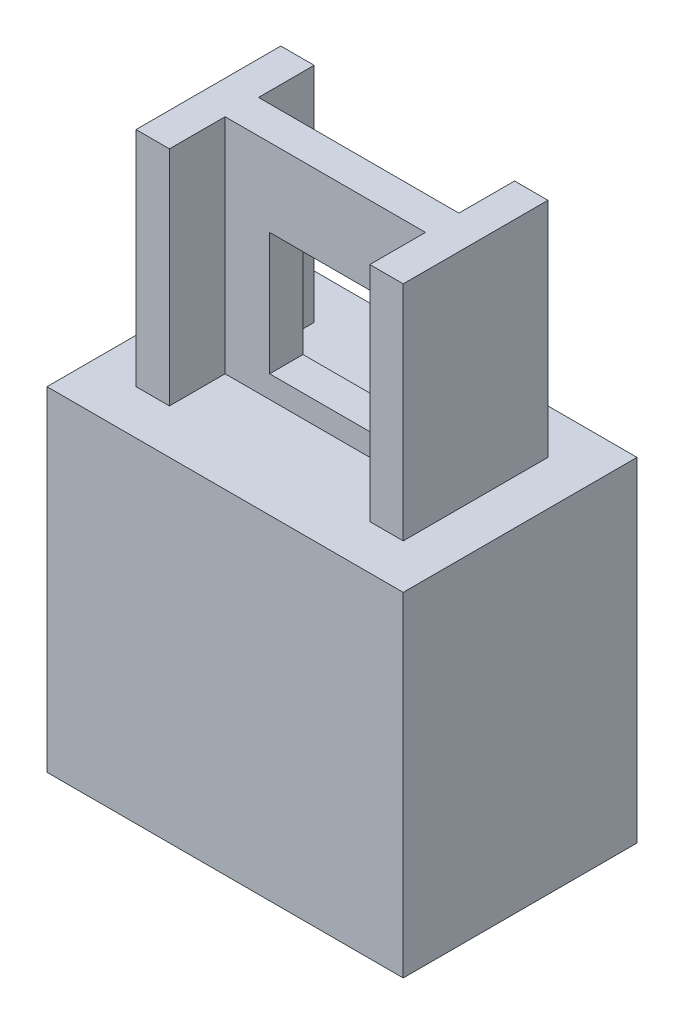
ISO-10303-21;
HEADER;
FILE_DESCRIPTION(('STEP AP214'),'2;1');
FILE_NAME('part.step','',(''),(''),'','','');
FILE_SCHEMA(('AUTOMOTIVE_DESIGN { 1 0 10303 214 1 1 1 1 }'));
ENDSEC;
DATA;
#1=APPLICATION_CONTEXT('core data for automotive mechanical design processes');
#2=APPLICATION_PROTOCOL_DEFINITION('international standard','automotive_design',2000,#1);
#3=PRODUCT_CONTEXT('',#1,'mechanical');
#4=PRODUCT('Part','Part','',(#3));
#5=PRODUCT_RELATED_PRODUCT_CATEGORY('part','',(#4));
#6=PRODUCT_DEFINITION_FORMATION('','',#4);
#7=PRODUCT_DEFINITION_CONTEXT('part definition',#1,'design');
#8=PRODUCT_DEFINITION('design','',#6,#7);
#9=PRODUCT_DEFINITION_SHAPE('','',#8);
#10=(LENGTH_UNIT() NAMED_UNIT(*) SI_UNIT(.MILLI.,.METRE.));
#11=(NAMED_UNIT(*) PLANE_ANGLE_UNIT() SI_UNIT($,.RADIAN.));
#12=(NAMED_UNIT(*) SI_UNIT($,.STERADIAN.) SOLID_ANGLE_UNIT());
#13=UNCERTAINTY_MEASURE_WITH_UNIT(LENGTH_MEASURE(1.E-05),#10,'distance_accuracy_value','');
#14=(GEOMETRIC_REPRESENTATION_CONTEXT(3) GLOBAL_UNCERTAINTY_ASSIGNED_CONTEXT((#13)) GLOBAL_UNIT_ASSIGNED_CONTEXT((#10,
#11,#12)) REPRESENTATION_CONTEXT('',''));
#15=CARTESIAN_POINT('',(0.,0.,0.));
#16=DIRECTION('',(0.,0.,1.));
#17=DIRECTION('',(1.,0.,0.));
#18=AXIS2_PLACEMENT_3D('',#15,#16,#17);
#19=CARTESIAN_POINT('',(-4.5,0.,0.75));
#20=DIRECTION('',(0.,0.,-1.));
#21=DIRECTION('',(-1.,0.,0.));
#22=AXIS2_PLACEMENT_3D('',#19,#20,#21);
#23=PLANE('',#22);
#24=DIRECTION('',(-1.,0.,0.));
#25=VECTOR('',#24,1.);
#26=CARTESIAN_POINT('',(-4.5,10.,0.75));
#27=LINE('',#26,#25);
#28=CARTESIAN_POINT('',(4.5,10.,0.75));
#29=VERTEX_POINT('',#28);
#30=CARTESIAN_POINT('',(-4.5,10.,0.75));
#31=VERTEX_POINT('',#30);
#32=EDGE_CURVE('E308',#29,#31,#27,.T.);
#33=ORIENTED_EDGE('',*,*,#32,.T.);
#34=DIRECTION('',(0.,1.,0.));
#35=VECTOR('',#34,1.);
#36=CARTESIAN_POINT('',(-4.5,0.,0.75));
#37=LINE('',#36,#35);
#38=CARTESIAN_POINT('',(-4.5,0.,0.75));
#39=VERTEX_POINT('',#38);
#40=EDGE_CURVE('E304',#39,#31,#37,.T.);
#41=ORIENTED_EDGE('',*,*,#40,.F.);
#42=DIRECTION('',(-1.,0.,0.));
#43=VECTOR('',#42,1.);
#44=CARTESIAN_POINT('',(-4.5,0.,0.75));
#45=LINE('',#44,#43);
#46=CARTESIAN_POINT('',(4.5,0.,0.75));
#47=VERTEX_POINT('',#46);
#48=EDGE_CURVE('E298',#47,#39,#45,.T.);
#49=ORIENTED_EDGE('',*,*,#48,.F.);
#50=DIRECTION('',(0.,1.,0.));
#51=VECTOR('',#50,1.);
#52=CARTESIAN_POINT('',(4.5,0.,0.75));
#53=LINE('',#52,#51);
#54=EDGE_CURVE('E301',#47,#29,#53,.T.);
#55=ORIENTED_EDGE('',*,*,#54,.T.);
#56=EDGE_LOOP('',(#33,#41,#49,#55));
#57=FACE_BOUND('',#56,.T.);
#58=DIRECTION('',(0.,1.,0.));
#59=VECTOR('',#58,1.);
#60=CARTESIAN_POINT('',(2.5,0.,0.75));
#61=LINE('',#60,#59);
#62=CARTESIAN_POINT('',(2.5,1.,0.75));
#63=VERTEX_POINT('',#62);
#64=CARTESIAN_POINT('',(2.5,6.5,0.75));
#65=VERTEX_POINT('',#64);
#66=EDGE_CURVE('E320',#63,#65,#61,.T.);
#67=ORIENTED_EDGE('',*,*,#66,.F.);
#68=DIRECTION('',(-1.,0.,0.));
#69=VECTOR('',#68,1.);
#70=CARTESIAN_POINT('',(-4.5,1.,0.75));
#71=LINE('',#70,#69);
#72=CARTESIAN_POINT('',(-2.5,1.,0.75));
#73=VERTEX_POINT('',#72);
#74=EDGE_CURVE('E370',#63,#73,#71,.T.);
#75=ORIENTED_EDGE('',*,*,#74,.T.);
#76=DIRECTION('',(0.,1.,0.));
#77=VECTOR('',#76,1.);
#78=CARTESIAN_POINT('',(-2.5,0.,0.75));
#79=LINE('',#78,#77);
#80=CARTESIAN_POINT('',(-2.5,6.5,0.75));
#81=VERTEX_POINT('',#80);
#82=EDGE_CURVE('E187',#73,#81,#79,.T.);
#83=ORIENTED_EDGE('',*,*,#82,.T.);
#84=DIRECTION('',(-1.,0.,0.));
#85=VECTOR('',#84,1.);
#86=CARTESIAN_POINT('',(-4.5,6.5,0.75));
#87=LINE('',#86,#85);
#88=EDGE_CURVE('E365',#65,#81,#87,.T.);
#89=ORIENTED_EDGE('',*,*,#88,.F.);
#90=EDGE_LOOP('',(#67,#75,#83,#89));
#91=FACE_BOUND('',#90,.T.);
#92=ADVANCED_FACE('F39',(#57,#91),#23,.F.);
#93=CARTESIAN_POINT('',(-4.5,0.,-0.75));
#94=DIRECTION('',(0.,0.,1.));
#95=DIRECTION('',(1.,0.,0.));
#96=AXIS2_PLACEMENT_3D('',#93,#94,#95);
#97=PLANE('',#96);
#98=DIRECTION('',(1.,0.,0.));
#99=VECTOR('',#98,1.);
#100=CARTESIAN_POINT('',(-4.5,10.,-0.75));
#101=LINE('',#100,#99);
#102=CARTESIAN_POINT('',(-4.5,10.,-0.75));
#103=VERTEX_POINT('',#102);
#104=CARTESIAN_POINT('',(4.5,10.,-0.75));
#105=VERTEX_POINT('',#104);
#106=EDGE_CURVE('E347',#103,#105,#101,.T.);
#107=ORIENTED_EDGE('',*,*,#106,.T.);
#108=DIRECTION('',(0.,1.,0.));
#109=VECTOR('',#108,1.);
#110=CARTESIAN_POINT('',(4.5,0.,-0.75));
#111=LINE('',#110,#109);
#112=CARTESIAN_POINT('',(4.5,0.,-0.75));
#113=VERTEX_POINT('',#112);
#114=EDGE_CURVE('E333',#113,#105,#111,.T.);
#115=ORIENTED_EDGE('',*,*,#114,.F.);
#116=DIRECTION('',(1.,0.,0.));
#117=VECTOR('',#116,1.);
#118=CARTESIAN_POINT('',(-4.5,0.,-0.75));
#119=LINE('',#118,#117);
#120=CARTESIAN_POINT('',(-4.5,0.,-0.75));
#121=VERTEX_POINT('',#120);
#122=EDGE_CURVE('E356',#121,#113,#119,.T.);
#123=ORIENTED_EDGE('',*,*,#122,.F.);
#124=DIRECTION('',(0.,1.,0.));
#125=VECTOR('',#124,1.);
#126=CARTESIAN_POINT('',(-4.5,0.,-0.75));
#127=LINE('',#126,#125);
#128=EDGE_CURVE('E330',#121,#103,#127,.T.);
#129=ORIENTED_EDGE('',*,*,#128,.T.);
#130=EDGE_LOOP('',(#107,#115,#123,#129));
#131=FACE_BOUND('',#130,.T.);
#132=DIRECTION('',(0.,-1.,0.));
#133=VECTOR('',#132,1.);
#134=CARTESIAN_POINT('',(2.5,0.,-0.75));
#135=LINE('',#134,#133);
#136=CARTESIAN_POINT('',(2.5,6.5,-0.75));
#137=VERTEX_POINT('',#136);
#138=CARTESIAN_POINT('',(2.5,1.,-0.75));
#139=VERTEX_POINT('',#138);
#140=EDGE_CURVE('E11',#137,#139,#135,.T.);
#141=ORIENTED_EDGE('',*,*,#140,.F.);
#142=DIRECTION('',(1.,0.,0.));
#143=VECTOR('',#142,1.);
#144=CARTESIAN_POINT('',(-4.5,6.5,-0.75));
#145=LINE('',#144,#143);
#146=CARTESIAN_POINT('',(-2.5,6.5,-0.75));
#147=VERTEX_POINT('',#146);
#148=EDGE_CURVE('E48',#147,#137,#145,.T.);
#149=ORIENTED_EDGE('',*,*,#148,.F.);
#150=DIRECTION('',(0.,-1.,0.));
#151=VECTOR('',#150,1.);
#152=CARTESIAN_POINT('',(-2.5,0.,-0.75));
#153=LINE('',#152,#151);
#154=CARTESIAN_POINT('',(-2.5,1.,-0.75));
#155=VERTEX_POINT('',#154);
#156=EDGE_CURVE('E179',#147,#155,#153,.T.);
#157=ORIENTED_EDGE('',*,*,#156,.T.);
#158=DIRECTION('',(1.,0.,0.));
#159=VECTOR('',#158,1.);
#160=CARTESIAN_POINT('',(-4.5,1.,-0.75));
#161=LINE('',#160,#159);
#162=EDGE_CURVE('E173',#155,#139,#161,.T.);
#163=ORIENTED_EDGE('',*,*,#162,.T.);
#164=EDGE_LOOP('',(#141,#149,#157,#163));
#165=FACE_BOUND('',#164,.T.);
#166=ADVANCED_FACE('F193',(#131,#165),#97,.F.);
#167=CARTESIAN_POINT('',(-6.,10.,-3.25));
#168=DIRECTION('',(0.,0.,1.));
#169=DIRECTION('',(1.,0.,0.));
#170=AXIS2_PLACEMENT_3D('',#167,#168,#169);
#171=PLANE('',#170);
#172=DIRECTION('',(-1.,0.,0.));
#173=VECTOR('',#172,1.);
#174=CARTESIAN_POINT('',(-6.,10.,-3.25));
#175=LINE('',#174,#173);
#176=CARTESIAN_POINT('',(-4.5,10.,-3.25));
#177=VERTEX_POINT('',#176);
#178=CARTESIAN_POINT('',(-6.,10.,-3.25));
#179=VERTEX_POINT('',#178);
#180=EDGE_CURVE('E245',#177,#179,#175,.T.);
#181=ORIENTED_EDGE('',*,*,#180,.F.);
#182=DIRECTION('',(0.,1.,0.));
#183=VECTOR('',#182,1.);
#184=CARTESIAN_POINT('',(-4.5,0.,-3.25));
#185=LINE('',#184,#183);
#186=CARTESIAN_POINT('',(-4.5,0.,-3.25));
#187=VERTEX_POINT('',#186);
#188=EDGE_CURVE('E278',#187,#177,#185,.T.);
#189=ORIENTED_EDGE('',*,*,#188,.F.);
#190=DIRECTION('',(-1.,0.,0.));
#191=VECTOR('',#190,1.);
#192=CARTESIAN_POINT('',(-6.,0.,-3.25));
#193=LINE('',#192,#191);
#194=CARTESIAN_POINT('',(-6.,0.,-3.25));
#195=VERTEX_POINT('',#194);
#196=EDGE_CURVE('E228',#187,#195,#193,.T.);
#197=ORIENTED_EDGE('',*,*,#196,.T.);
#198=DIRECTION('',(0.,-1.,0.));
#199=VECTOR('',#198,1.);
#200=CARTESIAN_POINT('',(-6.,10.,-3.25));
#201=LINE('',#200,#199);
#202=EDGE_CURVE('E201',#179,#195,#201,.T.);
#203=ORIENTED_EDGE('',*,*,#202,.F.);
#204=EDGE_LOOP('',(#181,#189,#197,#203));
#205=FACE_BOUND('',#204,.T.);
#206=ADVANCED_FACE('F415',(#205),#171,.F.);
#207=CARTESIAN_POINT('',(-6.,10.,3.25));
#208=DIRECTION('',(0.,0.,-1.));
#209=DIRECTION('',(-1.,0.,0.));
#210=AXIS2_PLACEMENT_3D('',#207,#208,#209);
#211=PLANE('',#210);
#212=DIRECTION('',(1.,0.,0.));
#213=VECTOR('',#212,1.);
#214=CARTESIAN_POINT('',(-6.,0.,3.25));
#215=LINE('',#214,#213);
#216=CARTESIAN_POINT('',(-6.,0.,3.25));
#217=VERTEX_POINT('',#216);
#218=CARTESIAN_POINT('',(-4.5,0.,3.25));
#219=VERTEX_POINT('',#218);
#220=EDGE_CURVE('E214',#217,#219,#215,.T.);
#221=ORIENTED_EDGE('',*,*,#220,.T.);
#222=DIRECTION('',(0.,1.,0.));
#223=VECTOR('',#222,1.);
#224=CARTESIAN_POINT('',(-4.5,0.,3.25));
#225=LINE('',#224,#223);
#226=CARTESIAN_POINT('',(-4.5,10.,3.25));
#227=VERTEX_POINT('',#226);
#228=EDGE_CURVE('E293',#219,#227,#225,.T.);
#229=ORIENTED_EDGE('',*,*,#228,.T.);
#230=DIRECTION('',(1.,0.,0.));
#231=VECTOR('',#230,1.);
#232=CARTESIAN_POINT('',(-6.,10.,3.25));
#233=LINE('',#232,#231);
#234=CARTESIAN_POINT('',(-6.,10.,3.25));
#235=VERTEX_POINT('',#234);
#236=EDGE_CURVE('E213',#235,#227,#233,.T.);
#237=ORIENTED_EDGE('',*,*,#236,.F.);
#238=DIRECTION('',(0.,-1.,0.));
#239=VECTOR('',#238,1.);
#240=CARTESIAN_POINT('',(-6.,10.,3.25));
#241=LINE('',#240,#239);
#242=EDGE_CURVE('E205',#235,#217,#241,.T.);
#243=ORIENTED_EDGE('',*,*,#242,.T.);
#244=EDGE_LOOP('',(#221,#229,#237,#243));
#245=FACE_BOUND('',#244,.T.);
#246=ADVANCED_FACE('F425',(#245),#211,.F.);
#247=CARTESIAN_POINT('',(6.,10.,-3.25));
#248=DIRECTION('',(-1.,0.,0.));
#249=DIRECTION('',(0.,0.,1.));
#250=AXIS2_PLACEMENT_3D('',#247,#248,#249);
#251=PLANE('',#250);
#252=DIRECTION('',(0.,0.,-1.));
#253=VECTOR('',#252,1.);
#254=CARTESIAN_POINT('',(6.,0.,-3.25));
#255=LINE('',#254,#253);
#256=CARTESIAN_POINT('',(6.,0.,3.25));
#257=VERTEX_POINT('',#256);
#258=CARTESIAN_POINT('',(6.,0.,-3.25));
#259=VERTEX_POINT('',#258);
#260=EDGE_CURVE('E229',#257,#259,#255,.T.);
#261=ORIENTED_EDGE('',*,*,#260,.T.);
#262=DIRECTION('',(0.,-1.,0.));
#263=VECTOR('',#262,1.);
#264=CARTESIAN_POINT('',(6.,10.,-3.25));
#265=LINE('',#264,#263);
#266=CARTESIAN_POINT('',(6.,10.,-3.25));
#267=VERTEX_POINT('',#266);
#268=EDGE_CURVE('E180',#267,#259,#265,.T.);
#269=ORIENTED_EDGE('',*,*,#268,.F.);
#270=DIRECTION('',(0.,0.,-1.));
#271=VECTOR('',#270,1.);
#272=CARTESIAN_POINT('',(6.,10.,-3.25));
#273=LINE('',#272,#271);
#274=CARTESIAN_POINT('',(6.,10.,3.25));
#275=VERTEX_POINT('',#274);
#276=EDGE_CURVE('E218',#275,#267,#273,.T.);
#277=ORIENTED_EDGE('',*,*,#276,.F.);
#278=DIRECTION('',(0.,-1.,0.));
#279=VECTOR('',#278,1.);
#280=CARTESIAN_POINT('',(6.,10.,3.25));
#281=LINE('',#280,#279);
#282=EDGE_CURVE('E209',#275,#257,#281,.T.);
#283=ORIENTED_EDGE('',*,*,#282,.T.);
#284=EDGE_LOOP('',(#261,#269,#277,#283));
#285=FACE_BOUND('',#284,.T.);
#286=ADVANCED_FACE('F41',(#285),#251,.F.);
#287=CARTESIAN_POINT('',(4.5,0.,-3.25));
#288=VERTEX_POINT('',#287);
#289=EDGE_CURVE('E224',#259,#288,#193,.T.);
#290=ORIENTED_EDGE('',*,*,#289,.T.);
#291=DIRECTION('',(0.,1.,0.));
#292=VECTOR('',#291,1.);
#293=CARTESIAN_POINT('',(4.5,0.,-3.25));
#294=LINE('',#293,#292);
#295=CARTESIAN_POINT('',(4.5,10.,-3.25));
#296=VERTEX_POINT('',#295);
#297=EDGE_CURVE('E337',#288,#296,#294,.T.);
#298=ORIENTED_EDGE('',*,*,#297,.T.);
#299=EDGE_CURVE('E241',#267,#296,#175,.T.);
#300=ORIENTED_EDGE('',*,*,#299,.F.);
#301=ORIENTED_EDGE('',*,*,#268,.T.);
#302=EDGE_LOOP('',(#290,#298,#300,#301));
#303=FACE_BOUND('',#302,.T.);
#304=ADVANCED_FACE('F400',(#303),#171,.F.);
#305=CARTESIAN_POINT('',(-6.,10.,-3.25));
#306=DIRECTION('',(1.,0.,0.));
#307=DIRECTION('',(0.,0.,-1.));
#308=AXIS2_PLACEMENT_3D('',#305,#306,#307);
#309=PLANE('',#308);
#310=DIRECTION('',(0.,0.,1.));
#311=VECTOR('',#310,1.);
#312=CARTESIAN_POINT('',(-6.,0.,-3.25));
#313=LINE('',#312,#311);
#314=EDGE_CURVE('E220',#195,#217,#313,.T.);
#315=ORIENTED_EDGE('',*,*,#314,.T.);
#316=ORIENTED_EDGE('',*,*,#242,.F.);
#317=DIRECTION('',(0.,0.,1.));
#318=VECTOR('',#317,1.);
#319=CARTESIAN_POINT('',(-6.,10.,-3.25));
#320=LINE('',#319,#318);
#321=EDGE_CURVE('E238',#179,#235,#320,.T.);
#322=ORIENTED_EDGE('',*,*,#321,.F.);
#323=ORIENTED_EDGE('',*,*,#202,.T.);
#324=EDGE_LOOP('',(#315,#316,#322,#323));
#325=FACE_BOUND('',#324,.T.);
#326=ADVANCED_FACE('F421',(#325),#309,.F.);
#327=CARTESIAN_POINT('',(4.5,10.,3.25));
#328=VERTEX_POINT('',#327);
#329=EDGE_CURVE('E237',#328,#275,#233,.T.);
#330=ORIENTED_EDGE('',*,*,#329,.F.);
#331=DIRECTION('',(0.,1.,0.));
#332=VECTOR('',#331,1.);
#333=CARTESIAN_POINT('',(4.5,0.,3.25));
#334=LINE('',#333,#332);
#335=CARTESIAN_POINT('',(4.5,0.,3.25));
#336=VERTEX_POINT('',#335);
#337=EDGE_CURVE('E297',#336,#328,#334,.T.);
#338=ORIENTED_EDGE('',*,*,#337,.F.);
#339=EDGE_CURVE('E219',#336,#257,#215,.T.);
#340=ORIENTED_EDGE('',*,*,#339,.T.);
#341=ORIENTED_EDGE('',*,*,#282,.F.);
#342=EDGE_LOOP('',(#330,#338,#340,#341));
#343=FACE_BOUND('',#342,.T.);
#344=ADVANCED_FACE('F395',(#343),#211,.F.);
#345=CARTESIAN_POINT('',(0.,10.,0.));
#346=DIRECTION('',(0.,1.,0.));
#347=DIRECTION('',(0.,0.,1.));
#348=AXIS2_PLACEMENT_3D('',#345,#346,#347);
#349=PLANE('',#348);
#350=DIRECTION('',(0.,0.,1.));
#351=VECTOR('',#350,1.);
#352=CARTESIAN_POINT('',(-4.5,10.,-3.25));
#353=LINE('',#352,#351);
#354=EDGE_CURVE('E307',#177,#103,#353,.T.);
#355=ORIENTED_EDGE('',*,*,#354,.F.);
#356=ORIENTED_EDGE('',*,*,#180,.T.);
#357=ORIENTED_EDGE('',*,*,#321,.T.);
#358=ORIENTED_EDGE('',*,*,#236,.T.);
#359=DIRECTION('',(0.,0.,1.));
#360=VECTOR('',#359,1.);
#361=CARTESIAN_POINT('',(-4.5,10.,3.25));
#362=LINE('',#361,#360);
#363=EDGE_CURVE('E317',#31,#227,#362,.T.);
#364=ORIENTED_EDGE('',*,*,#363,.F.);
#365=ORIENTED_EDGE('',*,*,#32,.F.);
#366=DIRECTION('',(0.,0.,-1.));
#367=VECTOR('',#366,1.);
#368=CARTESIAN_POINT('',(4.5,10.,3.25));
#369=LINE('',#368,#367);
#370=EDGE_CURVE('E313',#328,#29,#369,.T.);
#371=ORIENTED_EDGE('',*,*,#370,.F.);
#372=ORIENTED_EDGE('',*,*,#329,.T.);
#373=ORIENTED_EDGE('',*,*,#276,.T.);
#374=ORIENTED_EDGE('',*,*,#299,.T.);
#375=DIRECTION('',(0.,0.,-1.));
#376=VECTOR('',#375,1.);
#377=CARTESIAN_POINT('',(4.5,10.,-3.25));
#378=LINE('',#377,#376);
#379=EDGE_CURVE('E343',#105,#296,#378,.T.);
#380=ORIENTED_EDGE('',*,*,#379,.F.);
#381=ORIENTED_EDGE('',*,*,#106,.F.);
#382=EDGE_LOOP('',(#355,#356,#357,#358,#364,#365,#371,#372,#373,#374,#380,#381));
#383=FACE_BOUND('',#382,.T.);
#384=ADVANCED_FACE('F389',(#383),#349,.T.);
#385=CARTESIAN_POINT('',(0.,0.,0.));
#386=DIRECTION('',(0.,1.,0.));
#387=DIRECTION('',(0.,0.,1.));
#388=AXIS2_PLACEMENT_3D('',#385,#386,#387);
#389=PLANE('',#388);
#390=DIRECTION('',(1.,0.,0.));
#391=VECTOR('',#390,1.);
#392=CARTESIAN_POINT('',(-8.,0.,5.25));
#393=LINE('',#392,#391);
#394=CARTESIAN_POINT('',(-8.,0.,5.25));
#395=VERTEX_POINT('',#394);
#396=CARTESIAN_POINT('',(8.,0.,5.25));
#397=VERTEX_POINT('',#396);
#398=EDGE_CURVE('E274',#395,#397,#393,.T.);
#399=ORIENTED_EDGE('',*,*,#398,.T.);
#400=DIRECTION('',(0.,0.,-1.));
#401=VECTOR('',#400,1.);
#402=CARTESIAN_POINT('',(8.,0.,5.25));
#403=LINE('',#402,#401);
#404=CARTESIAN_POINT('',(8.,0.,-5.25));
#405=VERTEX_POINT('',#404);
#406=EDGE_CURVE('E270',#397,#405,#403,.T.);
#407=ORIENTED_EDGE('',*,*,#406,.T.);
#408=DIRECTION('',(-1.,0.,0.));
#409=VECTOR('',#408,1.);
#410=CARTESIAN_POINT('',(8.,0.,-5.25));
#411=LINE('',#410,#409);
#412=CARTESIAN_POINT('',(-8.,0.,-5.25));
#413=VERTEX_POINT('',#412);
#414=EDGE_CURVE('E266',#405,#413,#411,.T.);
#415=ORIENTED_EDGE('',*,*,#414,.T.);
#416=DIRECTION('',(0.,0.,1.));
#417=VECTOR('',#416,1.);
#418=CARTESIAN_POINT('',(-8.,0.,-5.25));
#419=LINE('',#418,#417);
#420=EDGE_CURVE('E261',#413,#395,#419,.T.);
#421=ORIENTED_EDGE('',*,*,#420,.T.);
#422=EDGE_LOOP('',(#399,#407,#415,#421));
#423=FACE_BOUND('',#422,.T.);
#424=ORIENTED_EDGE('',*,*,#260,.F.);
#425=ORIENTED_EDGE('',*,*,#339,.F.);
#426=DIRECTION('',(0.,0.,-1.));
#427=VECTOR('',#426,1.);
#428=CARTESIAN_POINT('',(4.5,0.,3.25));
#429=LINE('',#428,#427);
#430=EDGE_CURVE('E324',#336,#47,#429,.T.);
#431=ORIENTED_EDGE('',*,*,#430,.T.);
#432=ORIENTED_EDGE('',*,*,#48,.T.);
#433=DIRECTION('',(0.,0.,1.));
#434=VECTOR('',#433,1.);
#435=CARTESIAN_POINT('',(-4.5,0.,3.25));
#436=LINE('',#435,#434);
#437=EDGE_CURVE('E312',#39,#219,#436,.T.);
#438=ORIENTED_EDGE('',*,*,#437,.T.);
#439=ORIENTED_EDGE('',*,*,#220,.F.);
#440=ORIENTED_EDGE('',*,*,#314,.F.);
#441=ORIENTED_EDGE('',*,*,#196,.F.);
#442=DIRECTION('',(0.,0.,1.));
#443=VECTOR('',#442,1.);
#444=CARTESIAN_POINT('',(-4.5,0.,-3.25));
#445=LINE('',#444,#443);
#446=EDGE_CURVE('E346',#187,#121,#445,.T.);
#447=ORIENTED_EDGE('',*,*,#446,.T.);
#448=ORIENTED_EDGE('',*,*,#122,.T.);
#449=DIRECTION('',(0.,0.,-1.));
#450=VECTOR('',#449,1.);
#451=CARTESIAN_POINT('',(4.5,0.,-3.25));
#452=LINE('',#451,#450);
#453=EDGE_CURVE('E334',#113,#288,#452,.T.);
#454=ORIENTED_EDGE('',*,*,#453,.T.);
#455=ORIENTED_EDGE('',*,*,#289,.F.);
#456=EDGE_LOOP('',(#424,#425,#431,#432,#438,#439,#440,#441,#447,#448,#454,#455));
#457=FACE_BOUND('',#456,.T.);
#458=ADVANCED_FACE('F436',(#423,#457),#389,.T.);
#459=CARTESIAN_POINT('',(-8.,-15.,5.25));
#460=DIRECTION('',(0.,0.,1.));
#461=DIRECTION('',(1.,0.,0.));
#462=AXIS2_PLACEMENT_3D('',#459,#460,#461);
#463=PLANE('',#462);
#464=ORIENTED_EDGE('',*,*,#398,.F.);
#465=DIRECTION('',(0.,1.,0.));
#466=VECTOR('',#465,1.);
#467=CARTESIAN_POINT('',(-8.,-15.,5.25));
#468=LINE('',#467,#466);
#469=CARTESIAN_POINT('',(-8.,-15.,5.25));
#470=VERTEX_POINT('',#469);
#471=EDGE_CURVE('E233',#470,#395,#468,.T.);
#472=ORIENTED_EDGE('',*,*,#471,.F.);
#473=DIRECTION('',(1.,0.,0.));
#474=VECTOR('',#473,1.);
#475=CARTESIAN_POINT('',(-8.,-15.,5.25));
#476=LINE('',#475,#474);
#477=CARTESIAN_POINT('',(8.,-15.,5.25));
#478=VERTEX_POINT('',#477);
#479=EDGE_CURVE('E265',#470,#478,#476,.T.);
#480=ORIENTED_EDGE('',*,*,#479,.T.);
#481=DIRECTION('',(0.,1.,0.));
#482=VECTOR('',#481,1.);
#483=CARTESIAN_POINT('',(8.,-15.,5.25));
#484=LINE('',#483,#482);
#485=EDGE_CURVE('E249',#478,#397,#484,.T.);
#486=ORIENTED_EDGE('',*,*,#485,.T.);
#487=EDGE_LOOP('',(#464,#472,#480,#486));
#488=FACE_BOUND('',#487,.T.);
#489=ADVANCED_FACE('F438',(#488),#463,.T.);
#490=CARTESIAN_POINT('',(-8.,-15.,-5.25));
#491=DIRECTION('',(-1.,0.,0.));
#492=DIRECTION('',(0.,0.,1.));
#493=AXIS2_PLACEMENT_3D('',#490,#491,#492);
#494=PLANE('',#493);
#495=ORIENTED_EDGE('',*,*,#420,.F.);
#496=DIRECTION('',(0.,1.,0.));
#497=VECTOR('',#496,1.);
#498=CARTESIAN_POINT('',(-8.,-15.,-5.25));
#499=LINE('',#498,#497);
#500=CARTESIAN_POINT('',(-8.,-15.,-5.25));
#501=VERTEX_POINT('',#500);
#502=EDGE_CURVE('E256',#501,#413,#499,.T.);
#503=ORIENTED_EDGE('',*,*,#502,.F.);
#504=DIRECTION('',(0.,0.,1.));
#505=VECTOR('',#504,1.);
#506=CARTESIAN_POINT('',(-8.,-15.,-5.25));
#507=LINE('',#506,#505);
#508=EDGE_CURVE('E253',#501,#470,#507,.T.);
#509=ORIENTED_EDGE('',*,*,#508,.T.);
#510=ORIENTED_EDGE('',*,*,#471,.T.);
#511=EDGE_LOOP('',(#495,#503,#509,#510));
#512=FACE_BOUND('',#511,.T.);
#513=ADVANCED_FACE('F445',(#512),#494,.T.);
#514=CARTESIAN_POINT('',(8.,-15.,-5.25));
#515=DIRECTION('',(0.,0.,-1.));
#516=DIRECTION('',(-1.,0.,0.));
#517=AXIS2_PLACEMENT_3D('',#514,#515,#516);
#518=PLANE('',#517);
#519=ORIENTED_EDGE('',*,*,#414,.F.);
#520=DIRECTION('',(0.,1.,0.));
#521=VECTOR('',#520,1.);
#522=CARTESIAN_POINT('',(8.,-15.,-5.25));
#523=LINE('',#522,#521);
#524=CARTESIAN_POINT('',(8.,-15.,-5.25));
#525=VERTEX_POINT('',#524);
#526=EDGE_CURVE('E252',#525,#405,#523,.T.);
#527=ORIENTED_EDGE('',*,*,#526,.F.);
#528=DIRECTION('',(-1.,0.,0.));
#529=VECTOR('',#528,1.);
#530=CARTESIAN_POINT('',(8.,-15.,-5.25));
#531=LINE('',#530,#529);
#532=EDGE_CURVE('E282',#525,#501,#531,.T.);
#533=ORIENTED_EDGE('',*,*,#532,.T.);
#534=ORIENTED_EDGE('',*,*,#502,.T.);
#535=EDGE_LOOP('',(#519,#527,#533,#534));
#536=FACE_BOUND('',#535,.T.);
#537=ADVANCED_FACE('F469',(#536),#518,.T.);
#538=CARTESIAN_POINT('',(8.,-15.,5.25));
#539=DIRECTION('',(1.,0.,0.));
#540=DIRECTION('',(0.,0.,-1.));
#541=AXIS2_PLACEMENT_3D('',#538,#539,#540);
#542=PLANE('',#541);
#543=ORIENTED_EDGE('',*,*,#406,.F.);
#544=ORIENTED_EDGE('',*,*,#485,.F.);
#545=DIRECTION('',(0.,0.,-1.));
#546=VECTOR('',#545,1.);
#547=CARTESIAN_POINT('',(8.,-15.,5.25));
#548=LINE('',#547,#546);
#549=EDGE_CURVE('E286',#478,#525,#548,.T.);
#550=ORIENTED_EDGE('',*,*,#549,.T.);
#551=ORIENTED_EDGE('',*,*,#526,.T.);
#552=EDGE_LOOP('',(#543,#544,#550,#551));
#553=FACE_BOUND('',#552,.T.);
#554=ADVANCED_FACE('F464',(#553),#542,.T.);
#555=CARTESIAN_POINT('',(0.,-15.,0.));
#556=DIRECTION('',(0.,1.,0.));
#557=DIRECTION('',(0.,0.,1.));
#558=AXIS2_PLACEMENT_3D('',#555,#556,#557);
#559=PLANE('',#558);
#560=ORIENTED_EDGE('',*,*,#479,.F.);
#561=ORIENTED_EDGE('',*,*,#508,.F.);
#562=ORIENTED_EDGE('',*,*,#532,.F.);
#563=ORIENTED_EDGE('',*,*,#549,.F.);
#564=EDGE_LOOP('',(#560,#561,#562,#563));
#565=FACE_BOUND('',#564,.T.);
#566=ADVANCED_FACE('F462',(#565),#559,.F.);
#567=CARTESIAN_POINT('',(-4.5,0.,3.25));
#568=DIRECTION('',(-1.,0.,0.));
#569=DIRECTION('',(0.,0.,1.));
#570=AXIS2_PLACEMENT_3D('',#567,#568,#569);
#571=PLANE('',#570);
#572=ORIENTED_EDGE('',*,*,#363,.T.);
#573=ORIENTED_EDGE('',*,*,#228,.F.);
#574=ORIENTED_EDGE('',*,*,#437,.F.);
#575=ORIENTED_EDGE('',*,*,#40,.T.);
#576=EDGE_LOOP('',(#572,#573,#574,#575));
#577=FACE_BOUND('',#576,.T.);
#578=ADVANCED_FACE('F429',(#577),#571,.F.);
#579=CARTESIAN_POINT('',(4.5,0.,3.25));
#580=DIRECTION('',(1.,0.,0.));
#581=DIRECTION('',(0.,0.,-1.));
#582=AXIS2_PLACEMENT_3D('',#579,#580,#581);
#583=PLANE('',#582);
#584=ORIENTED_EDGE('',*,*,#370,.T.);
#585=ORIENTED_EDGE('',*,*,#54,.F.);
#586=ORIENTED_EDGE('',*,*,#430,.F.);
#587=ORIENTED_EDGE('',*,*,#337,.T.);
#588=EDGE_LOOP('',(#584,#585,#586,#587));
#589=FACE_BOUND('',#588,.T.);
#590=ADVANCED_FACE('F434',(#589),#583,.F.);
#591=CARTESIAN_POINT('',(-4.5,0.,-3.25));
#592=DIRECTION('',(-1.,0.,0.));
#593=DIRECTION('',(0.,0.,1.));
#594=AXIS2_PLACEMENT_3D('',#591,#592,#593);
#595=PLANE('',#594);
#596=ORIENTED_EDGE('',*,*,#354,.T.);
#597=ORIENTED_EDGE('',*,*,#128,.F.);
#598=ORIENTED_EDGE('',*,*,#446,.F.);
#599=ORIENTED_EDGE('',*,*,#188,.T.);
#600=EDGE_LOOP('',(#596,#597,#598,#599));
#601=FACE_BOUND('',#600,.T.);
#602=ADVANCED_FACE('F410',(#601),#595,.F.);
#603=CARTESIAN_POINT('',(4.5,0.,-3.25));
#604=DIRECTION('',(1.,0.,0.));
#605=DIRECTION('',(0.,0.,-1.));
#606=AXIS2_PLACEMENT_3D('',#603,#604,#605);
#607=PLANE('',#606);
#608=ORIENTED_EDGE('',*,*,#379,.T.);
#609=ORIENTED_EDGE('',*,*,#297,.F.);
#610=ORIENTED_EDGE('',*,*,#453,.F.);
#611=ORIENTED_EDGE('',*,*,#114,.T.);
#612=EDGE_LOOP('',(#608,#609,#610,#611));
#613=FACE_BOUND('',#612,.T.);
#614=ADVANCED_FACE('F405',(#613),#607,.F.);
#615=CARTESIAN_POINT('',(2.5,1.,5.25));
#616=DIRECTION('',(-1.,0.,0.));
#617=DIRECTION('',(0.,0.,1.));
#618=AXIS2_PLACEMENT_3D('',#615,#616,#617);
#619=PLANE('',#618);
#620=ORIENTED_EDGE('',*,*,#66,.T.);
#621=DIRECTION('',(0.,0.,-1.));
#622=VECTOR('',#621,1.);
#623=CARTESIAN_POINT('',(2.5,6.5,5.25));
#624=LINE('',#623,#622);
#625=EDGE_CURVE('E373',#65,#137,#624,.T.);
#626=ORIENTED_EDGE('',*,*,#625,.T.);
#627=ORIENTED_EDGE('',*,*,#140,.T.);
#628=DIRECTION('',(0.,0.,-1.));
#629=VECTOR('',#628,1.);
#630=CARTESIAN_POINT('',(2.5,1.,5.25));
#631=LINE('',#630,#629);
#632=EDGE_CURVE('E60',#63,#139,#631,.T.);
#633=ORIENTED_EDGE('',*,*,#632,.F.);
#634=EDGE_LOOP('',(#620,#626,#627,#633));
#635=FACE_BOUND('',#634,.T.);
#636=ADVANCED_FACE('F580',(#635),#619,.T.);
#637=CARTESIAN_POINT('',(2.5,6.5,5.25));
#638=DIRECTION('',(0.,-1.,0.));
#639=DIRECTION('',(0.,0.,-1.));
#640=AXIS2_PLACEMENT_3D('',#637,#638,#639);
#641=PLANE('',#640);
#642=ORIENTED_EDGE('',*,*,#88,.T.);
#643=DIRECTION('',(0.,0.,-1.));
#644=VECTOR('',#643,1.);
#645=CARTESIAN_POINT('',(-2.5,6.5,5.25));
#646=LINE('',#645,#644);
#647=EDGE_CURVE('E190',#81,#147,#646,.T.);
#648=ORIENTED_EDGE('',*,*,#647,.T.);
#649=ORIENTED_EDGE('',*,*,#148,.T.);
#650=ORIENTED_EDGE('',*,*,#625,.F.);
#651=EDGE_LOOP('',(#642,#648,#649,#650));
#652=FACE_BOUND('',#651,.T.);
#653=ADVANCED_FACE('F597',(#652),#641,.T.);
#654=CARTESIAN_POINT('',(-2.5,1.,5.25));
#655=DIRECTION('',(-1.,0.,0.));
#656=DIRECTION('',(0.,0.,1.));
#657=AXIS2_PLACEMENT_3D('',#654,#655,#656);
#658=PLANE('',#657);
#659=DIRECTION('',(0.,0.,-1.));
#660=VECTOR('',#659,1.);
#661=CARTESIAN_POINT('',(-2.5,1.,5.25));
#662=LINE('',#661,#660);
#663=EDGE_CURVE('E55',#73,#155,#662,.T.);
#664=ORIENTED_EDGE('',*,*,#663,.T.);
#665=ORIENTED_EDGE('',*,*,#156,.F.);
#666=ORIENTED_EDGE('',*,*,#647,.F.);
#667=ORIENTED_EDGE('',*,*,#82,.F.);
#668=EDGE_LOOP('',(#664,#665,#666,#667));
#669=FACE_BOUND('',#668,.T.);
#670=ADVANCED_FACE('F183',(#669),#658,.F.);
#671=CARTESIAN_POINT('',(2.5,1.,5.25));
#672=DIRECTION('',(0.,-1.,0.));
#673=DIRECTION('',(0.,0.,-1.));
#674=AXIS2_PLACEMENT_3D('',#671,#672,#673);
#675=PLANE('',#674);
#676=ORIENTED_EDGE('',*,*,#632,.T.);
#677=ORIENTED_EDGE('',*,*,#162,.F.);
#678=ORIENTED_EDGE('',*,*,#663,.F.);
#679=ORIENTED_EDGE('',*,*,#74,.F.);
#680=EDGE_LOOP('',(#676,#677,#678,#679));
#681=FACE_BOUND('',#680,.T.);
#682=ADVANCED_FACE('F174',(#681),#675,.F.);
#683=CLOSED_SHELL('',(#92,#166,#206,#246,#286,#304,#326,#344,#384,#458,#489,#513,#537,#554,#566,
#578,#590,#602,#614,#636,#653,#670,#682));
#684=MANIFOLD_SOLID_BREP('B2',#683);
#685=ADVANCED_BREP_SHAPE_REPRESENTATION('',(#18,#684),#14);
#686=SHAPE_DEFINITION_REPRESENTATION(#9,#685);
ENDSEC;
END-ISO-10303-21;
